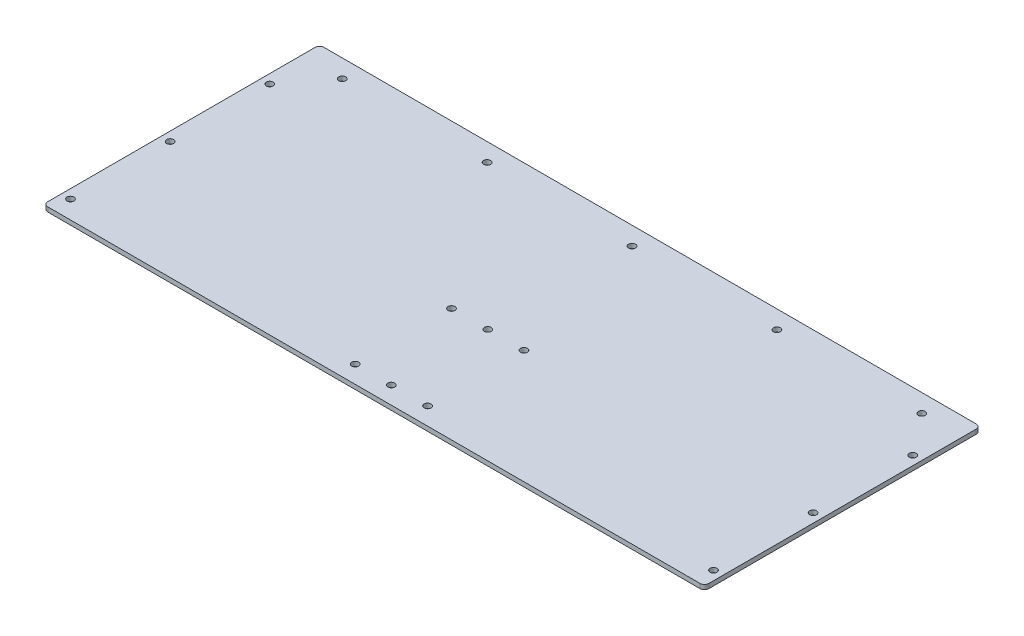
ISO-10303-21;
HEADER;
FILE_DESCRIPTION(('STEP AP214'),'2;1');
FILE_NAME('part.step','',(''),(''),'','','');
FILE_SCHEMA(('AUTOMOTIVE_DESIGN { 1 0 10303 214 1 1 1 1 }'));
ENDSEC;
DATA;
#1=APPLICATION_CONTEXT('core data for automotive mechanical design processes');
#2=APPLICATION_PROTOCOL_DEFINITION('international standard','automotive_design',2000,#1);
#3=PRODUCT_CONTEXT('',#1,'mechanical');
#4=PRODUCT('Part','Part','',(#3));
#5=PRODUCT_RELATED_PRODUCT_CATEGORY('part','',(#4));
#6=PRODUCT_DEFINITION_FORMATION('','',#4);
#7=PRODUCT_DEFINITION_CONTEXT('part definition',#1,'design');
#8=PRODUCT_DEFINITION('design','',#6,#7);
#9=PRODUCT_DEFINITION_SHAPE('','',#8);
#10=(LENGTH_UNIT() NAMED_UNIT(*) SI_UNIT(.MILLI.,.METRE.));
#11=(NAMED_UNIT(*) PLANE_ANGLE_UNIT() SI_UNIT($,.RADIAN.));
#12=(NAMED_UNIT(*) SI_UNIT($,.STERADIAN.) SOLID_ANGLE_UNIT());
#13=UNCERTAINTY_MEASURE_WITH_UNIT(LENGTH_MEASURE(1.E-05),#10,'distance_accuracy_value','');
#14=(GEOMETRIC_REPRESENTATION_CONTEXT(3) GLOBAL_UNCERTAINTY_ASSIGNED_CONTEXT((#13)) GLOBAL_UNIT_ASSIGNED_CONTEXT((#10,
#11,#12)) REPRESENTATION_CONTEXT('',''));
#15=CARTESIAN_POINT('',(0.,0.,0.));
#16=DIRECTION('',(0.,0.,1.));
#17=DIRECTION('',(1.,0.,0.));
#18=AXIS2_PLACEMENT_3D('',#15,#16,#17);
#19=CARTESIAN_POINT('',(0.,3.175,0.));
#20=DIRECTION('',(0.,-1.,0.));
#21=DIRECTION('',(0.,0.,-1.));
#22=AXIS2_PLACEMENT_3D('',#19,#20,#21);
#23=PLANE('',#22);
#24=CARTESIAN_POINT('',(6.34999999999974,3.175,-82.55));
#25=DIRECTION('',(0.,1.,0.));
#26=DIRECTION('',(0.,0.,1.));
#27=AXIS2_PLACEMENT_3D('',#24,#25,#26);
#28=CIRCLE('',#27,2.4257);
#29=CARTESIAN_POINT('',(6.34999999999974,3.175,-80.1243));
#30=VERTEX_POINT('',#29);
#31=EDGE_CURVE('E312',#30,#30,#28,.T.);
#32=ORIENTED_EDGE('',*,*,#31,.F.);
#33=EDGE_LOOP('',(#32));
#34=FACE_BOUND('',#33,.T.);
#35=CARTESIAN_POINT('',(6.34999999999952,3.175,-152.4));
#36=DIRECTION('',(0.,1.,0.));
#37=DIRECTION('',(0.,0.,1.));
#38=AXIS2_PLACEMENT_3D('',#35,#36,#37);
#39=CIRCLE('',#38,2.4257);
#40=CARTESIAN_POINT('',(6.34999999999952,3.175,-149.9743));
#41=VERTEX_POINT('',#40);
#42=EDGE_CURVE('E303',#41,#41,#39,.T.);
#43=ORIENTED_EDGE('',*,*,#42,.F.);
#44=EDGE_LOOP('',(#43));
#45=FACE_BOUND('',#44,.T.);
#46=CARTESIAN_POINT('',(457.200000000001,3.175,-152.4));
#47=DIRECTION('',(0.,1.,0.));
#48=DIRECTION('',(0.,0.,-1.));
#49=AXIS2_PLACEMENT_3D('',#46,#47,#48);
#50=CIRCLE('',#49,2.42570000000009);
#51=CARTESIAN_POINT('',(457.200000000001,3.175,-154.8257));
#52=VERTEX_POINT('',#51);
#53=EDGE_CURVE('E335',#52,#52,#50,.T.);
#54=ORIENTED_EDGE('',*,*,#53,.F.);
#55=EDGE_LOOP('',(#54));
#56=FACE_BOUND('',#55,.T.);
#57=CARTESIAN_POINT('',(457.200000000001,3.175,-82.5500000000001));
#58=DIRECTION('',(0.,1.,0.));
#59=DIRECTION('',(0.,0.,-1.));
#60=AXIS2_PLACEMENT_3D('',#57,#58,#59);
#61=CIRCLE('',#60,2.42569999999997);
#62=CARTESIAN_POINT('',(457.200000000001,3.175,-84.9757000000001));
#63=VERTEX_POINT('',#62);
#64=EDGE_CURVE('E327',#63,#63,#61,.T.);
#65=ORIENTED_EDGE('',*,*,#64,.F.);
#66=EDGE_LOOP('',(#65));
#67=FACE_BOUND('',#66,.T.);
#68=CARTESIAN_POINT('',(457.2,3.175,-12.7000000000001));
#69=DIRECTION('',(0.,1.,0.));
#70=DIRECTION('',(0.,0.,-1.));
#71=AXIS2_PLACEMENT_3D('',#68,#69,#70);
#72=CIRCLE('',#71,2.42569999999997);
#73=CARTESIAN_POINT('',(457.2,3.175,-15.1257000000001));
#74=VERTEX_POINT('',#73);
#75=EDGE_CURVE('E319',#74,#74,#72,.T.);
#76=ORIENTED_EDGE('',*,*,#75,.F.);
#77=EDGE_LOOP('',(#76));
#78=FACE_BOUND('',#77,.T.);
#79=CARTESIAN_POINT('',(6.34999999999991,3.175,-12.7));
#80=DIRECTION('',(0.,1.,0.));
#81=DIRECTION('',(0.,0.,1.));
#82=AXIS2_PLACEMENT_3D('',#79,#80,#81);
#83=CIRCLE('',#82,2.4257);
#84=CARTESIAN_POINT('',(6.34999999999991,3.175,-10.2743));
#85=VERTEX_POINT('',#84);
#86=EDGE_CURVE('E295',#85,#85,#83,.T.);
#87=ORIENTED_EDGE('',*,*,#86,.F.);
#88=EDGE_LOOP('',(#87));
#89=FACE_BOUND('',#88,.T.);
#90=DIRECTION('',(-1.,0.,0.));
#91=VECTOR('',#90,1.);
#92=CARTESIAN_POINT('',(0.,3.175,-193.675));
#93=LINE('',#92,#91);
#94=CARTESIAN_POINT('',(460.375,3.175,-193.675));
#95=VERTEX_POINT('',#94);
#96=CARTESIAN_POINT('',(3.17499999999998,3.175,-193.675));
#97=VERTEX_POINT('',#96);
#98=EDGE_CURVE('E146',#95,#97,#93,.T.);
#99=ORIENTED_EDGE('',*,*,#98,.T.);
#100=CARTESIAN_POINT('',(3.17499999999998,3.175,-190.5));
#101=DIRECTION('',(0.,-1.,0.));
#102=DIRECTION('',(0.,0.,-1.));
#103=AXIS2_PLACEMENT_3D('',#100,#101,#102);
#104=CIRCLE('',#103,3.175);
#105=CARTESIAN_POINT('',(0.,3.175,-190.5));
#106=VERTEX_POINT('',#105);
#107=EDGE_CURVE('E176',#97,#106,#104,.F.);
#108=ORIENTED_EDGE('',*,*,#107,.T.);
#109=DIRECTION('',(0.,0.,1.));
#110=VECTOR('',#109,1.);
#111=CARTESIAN_POINT('',(0.,3.175,0.));
#112=LINE('',#111,#110);
#113=CARTESIAN_POINT('',(0.,3.175,-3.17500000000001));
#114=VERTEX_POINT('',#113);
#115=EDGE_CURVE('E124',#106,#114,#112,.T.);
#116=ORIENTED_EDGE('',*,*,#115,.T.);
#117=CARTESIAN_POINT('',(3.17499999999998,3.175,-3.17500000000001));
#118=DIRECTION('',(0.,-1.,0.));
#119=DIRECTION('',(0.,0.,-1.));
#120=AXIS2_PLACEMENT_3D('',#117,#118,#119);
#121=CIRCLE('',#120,3.175);
#122=CARTESIAN_POINT('',(3.17499999999998,3.175,0.));
#123=VERTEX_POINT('',#122);
#124=EDGE_CURVE('E168',#114,#123,#121,.F.);
#125=ORIENTED_EDGE('',*,*,#124,.T.);
#126=DIRECTION('',(1.,0.,0.));
#127=VECTOR('',#126,1.);
#128=CARTESIAN_POINT('',(0.,3.175,0.));
#129=LINE('',#128,#127);
#130=CARTESIAN_POINT('',(460.375,3.175,0.));
#131=VERTEX_POINT('',#130);
#132=EDGE_CURVE('E192',#123,#131,#129,.T.);
#133=ORIENTED_EDGE('',*,*,#132,.T.);
#134=CARTESIAN_POINT('',(460.375,3.175,-3.17499999999998));
#135=DIRECTION('',(0.,-1.,0.));
#136=DIRECTION('',(0.,0.,-1.));
#137=AXIS2_PLACEMENT_3D('',#134,#135,#136);
#138=CIRCLE('',#137,3.175);
#139=CARTESIAN_POINT('',(463.55,3.175,-3.17500000000001));
#140=VERTEX_POINT('',#139);
#141=EDGE_CURVE('E59',#131,#140,#138,.F.);
#142=ORIENTED_EDGE('',*,*,#141,.T.);
#143=DIRECTION('',(0.,0.,-1.));
#144=VECTOR('',#143,1.);
#145=CARTESIAN_POINT('',(463.55,3.175,0.));
#146=LINE('',#145,#144);
#147=CARTESIAN_POINT('',(463.55,3.175,-190.5));
#148=VERTEX_POINT('',#147);
#149=EDGE_CURVE('E200',#140,#148,#146,.T.);
#150=ORIENTED_EDGE('',*,*,#149,.T.);
#151=CARTESIAN_POINT('',(460.375,3.175,-190.5));
#152=DIRECTION('',(0.,-1.,0.));
#153=DIRECTION('',(0.,0.,-1.));
#154=AXIS2_PLACEMENT_3D('',#151,#152,#153);
#155=CIRCLE('',#154,3.175);
#156=EDGE_CURVE('E173',#148,#95,#155,.F.);
#157=ORIENTED_EDGE('',*,*,#156,.T.);
#158=EDGE_LOOP('',(#99,#108,#116,#125,#133,#142,#150,#157));
#159=FACE_BOUND('',#158,.T.);
#160=CARTESIAN_POINT('',(231.775,3.175,-12.2555));
#161=DIRECTION('',(0.,1.,0.));
#162=DIRECTION('',(0.,0.,1.));
#163=AXIS2_PLACEMENT_3D('',#160,#161,#162);
#164=CIRCLE('',#163,2.4257);
#165=CARTESIAN_POINT('',(231.775,3.175,-9.8298));
#166=VERTEX_POINT('',#165);
#167=EDGE_CURVE('E134',#166,#166,#164,.T.);
#168=ORIENTED_EDGE('',*,*,#167,.F.);
#169=EDGE_LOOP('',(#168));
#170=FACE_BOUND('',#169,.T.);
#171=CARTESIAN_POINT('',(257.175,3.175,-12.2555));
#172=DIRECTION('',(0.,1.,0.));
#173=DIRECTION('',(0.,0.,1.));
#174=AXIS2_PLACEMENT_3D('',#171,#172,#173);
#175=CIRCLE('',#174,2.42569999999997);
#176=CARTESIAN_POINT('',(257.175,3.175,-9.82980000000003));
#177=VERTEX_POINT('',#176);
#178=EDGE_CURVE('E213',#177,#177,#175,.T.);
#179=ORIENTED_EDGE('',*,*,#178,.F.);
#180=EDGE_LOOP('',(#179));
#181=FACE_BOUND('',#180,.T.);
#182=CARTESIAN_POINT('',(206.375,3.175,-12.2555));
#183=DIRECTION('',(0.,1.,0.));
#184=DIRECTION('',(0.,0.,-1.));
#185=AXIS2_PLACEMENT_3D('',#182,#183,#184);
#186=CIRCLE('',#185,2.42569999999997);
#187=CARTESIAN_POINT('',(206.375,3.175,-14.6812));
#188=VERTEX_POINT('',#187);
#189=EDGE_CURVE('E219',#188,#188,#186,.T.);
#190=ORIENTED_EDGE('',*,*,#189,.F.);
#191=EDGE_LOOP('',(#190));
#192=FACE_BOUND('',#191,.T.);
#193=CARTESIAN_POINT('',(257.175,3.175,-79.8195000000001));
#194=DIRECTION('',(0.,1.,0.));
#195=DIRECTION('',(0.,0.,-1.));
#196=AXIS2_PLACEMENT_3D('',#193,#194,#195);
#197=CIRCLE('',#196,2.42569999999997);
#198=CARTESIAN_POINT('',(257.175,3.175,-82.2452));
#199=VERTEX_POINT('',#198);
#200=EDGE_CURVE('E227',#199,#199,#197,.T.);
#201=ORIENTED_EDGE('',*,*,#200,.F.);
#202=EDGE_LOOP('',(#201));
#203=FACE_BOUND('',#202,.T.);
#204=CARTESIAN_POINT('',(231.775,3.175,-79.8195000000001));
#205=DIRECTION('',(0.,1.,0.));
#206=DIRECTION('',(0.,0.,-1.));
#207=AXIS2_PLACEMENT_3D('',#204,#205,#206);
#208=CIRCLE('',#207,2.4257);
#209=CARTESIAN_POINT('',(231.775,3.175,-82.2452000000001));
#210=VERTEX_POINT('',#209);
#211=EDGE_CURVE('E235',#210,#210,#208,.T.);
#212=ORIENTED_EDGE('',*,*,#211,.F.);
#213=EDGE_LOOP('',(#212));
#214=FACE_BOUND('',#213,.T.);
#215=CARTESIAN_POINT('',(206.375,3.175,-79.8195000000001));
#216=DIRECTION('',(0.,1.,0.));
#217=DIRECTION('',(0.,0.,1.));
#218=AXIS2_PLACEMENT_3D('',#215,#216,#217);
#219=CIRCLE('',#218,2.42569999999997);
#220=CARTESIAN_POINT('',(206.375,3.175,-77.3938000000001));
#221=VERTEX_POINT('',#220);
#222=EDGE_CURVE('E243',#221,#221,#219,.T.);
#223=ORIENTED_EDGE('',*,*,#222,.F.);
#224=EDGE_LOOP('',(#223));
#225=FACE_BOUND('',#224,.T.);
#226=CARTESIAN_POINT('',(231.775,3.175,-180.975));
#227=DIRECTION('',(0.,1.,0.));
#228=DIRECTION('',(0.,0.,1.));
#229=AXIS2_PLACEMENT_3D('',#226,#227,#228);
#230=CIRCLE('',#229,2.4257);
#231=CARTESIAN_POINT('',(231.775,3.175,-178.5493));
#232=VERTEX_POINT('',#231);
#233=EDGE_CURVE('E251',#232,#232,#230,.T.);
#234=ORIENTED_EDGE('',*,*,#233,.F.);
#235=EDGE_LOOP('',(#234));
#236=FACE_BOUND('',#235,.T.);
#237=CARTESIAN_POINT('',(333.375,3.175,-180.975));
#238=DIRECTION('',(0.,1.,0.));
#239=DIRECTION('',(0.,0.,1.));
#240=AXIS2_PLACEMENT_3D('',#237,#238,#239);
#241=CIRCLE('',#240,2.42569999999997);
#242=CARTESIAN_POINT('',(333.375,3.175,-178.5493));
#243=VERTEX_POINT('',#242);
#244=EDGE_CURVE('E259',#243,#243,#241,.T.);
#245=ORIENTED_EDGE('',*,*,#244,.F.);
#246=EDGE_LOOP('',(#245));
#247=FACE_BOUND('',#246,.T.);
#248=CARTESIAN_POINT('',(434.975,3.175,-180.975));
#249=DIRECTION('',(0.,1.,0.));
#250=DIRECTION('',(0.,0.,1.));
#251=AXIS2_PLACEMENT_3D('',#248,#249,#250);
#252=CIRCLE('',#251,2.42569999999997);
#253=CARTESIAN_POINT('',(434.975,3.175,-178.5493));
#254=VERTEX_POINT('',#253);
#255=EDGE_CURVE('E267',#254,#254,#252,.T.);
#256=ORIENTED_EDGE('',*,*,#255,.F.);
#257=EDGE_LOOP('',(#256));
#258=FACE_BOUND('',#257,.T.);
#259=CARTESIAN_POINT('',(28.575,3.175,-180.975));
#260=DIRECTION('',(0.,1.,0.));
#261=DIRECTION('',(0.,0.,-1.));
#262=AXIS2_PLACEMENT_3D('',#259,#260,#261);
#263=CIRCLE('',#262,2.42569999999997);
#264=CARTESIAN_POINT('',(28.575,3.175,-183.4007));
#265=VERTEX_POINT('',#264);
#266=EDGE_CURVE('E275',#265,#265,#263,.T.);
#267=ORIENTED_EDGE('',*,*,#266,.F.);
#268=EDGE_LOOP('',(#267));
#269=FACE_BOUND('',#268,.T.);
#270=CARTESIAN_POINT('',(130.175,3.175,-180.975));
#271=DIRECTION('',(0.,1.,0.));
#272=DIRECTION('',(0.,0.,-1.));
#273=AXIS2_PLACEMENT_3D('',#270,#271,#272);
#274=CIRCLE('',#273,2.42569999999997);
#275=CARTESIAN_POINT('',(130.175,3.175,-183.4007));
#276=VERTEX_POINT('',#275);
#277=EDGE_CURVE('E283',#276,#276,#274,.T.);
#278=ORIENTED_EDGE('',*,*,#277,.F.);
#279=EDGE_LOOP('',(#278));
#280=FACE_BOUND('',#279,.T.);
#281=ADVANCED_FACE('F36',(#34,#45,#56,#67,#78,#89,#159,#170,#181,#192,#203,#214,#225,#236,#247,
#258,#269,#280),#23,.F.);
#282=CARTESIAN_POINT('',(0.,0.,0.));
#283=DIRECTION('',(0.,-1.,0.));
#284=DIRECTION('',(0.,0.,-1.));
#285=AXIS2_PLACEMENT_3D('',#282,#283,#284);
#286=PLANE('',#285);
#287=CARTESIAN_POINT('',(6.34999999999974,0.,-82.55));
#288=DIRECTION('',(0.,1.,0.));
#289=DIRECTION('',(0.,0.,1.));
#290=AXIS2_PLACEMENT_3D('',#287,#288,#289);
#291=CIRCLE('',#290,2.4257);
#292=CARTESIAN_POINT('',(6.34999999999974,0.,-80.1243));
#293=VERTEX_POINT('',#292);
#294=EDGE_CURVE('E299',#293,#293,#291,.T.);
#295=ORIENTED_EDGE('',*,*,#294,.T.);
#296=EDGE_LOOP('',(#295));
#297=FACE_BOUND('',#296,.T.);
#298=CARTESIAN_POINT('',(6.34999999999952,0.,-152.4));
#299=DIRECTION('',(0.,1.,0.));
#300=DIRECTION('',(0.,0.,1.));
#301=AXIS2_PLACEMENT_3D('',#298,#299,#300);
#302=CIRCLE('',#301,2.4257);
#303=CARTESIAN_POINT('',(6.34999999999952,0.,-149.9743));
#304=VERTEX_POINT('',#303);
#305=EDGE_CURVE('E307',#304,#304,#302,.T.);
#306=ORIENTED_EDGE('',*,*,#305,.T.);
#307=EDGE_LOOP('',(#306));
#308=FACE_BOUND('',#307,.T.);
#309=CARTESIAN_POINT('',(457.200000000001,0.,-152.4));
#310=DIRECTION('',(0.,1.,0.));
#311=DIRECTION('',(0.,0.,-1.));
#312=AXIS2_PLACEMENT_3D('',#309,#310,#311);
#313=CIRCLE('',#312,2.42570000000009);
#314=CARTESIAN_POINT('',(457.200000000001,0.,-154.8257));
#315=VERTEX_POINT('',#314);
#316=EDGE_CURVE('E308',#315,#315,#313,.T.);
#317=ORIENTED_EDGE('',*,*,#316,.T.);
#318=EDGE_LOOP('',(#317));
#319=FACE_BOUND('',#318,.T.);
#320=CARTESIAN_POINT('',(457.200000000001,0.,-82.5500000000001));
#321=DIRECTION('',(0.,1.,0.));
#322=DIRECTION('',(0.,0.,-1.));
#323=AXIS2_PLACEMENT_3D('',#320,#321,#322);
#324=CIRCLE('',#323,2.42569999999997);
#325=CARTESIAN_POINT('',(457.200000000001,0.,-84.9757000000001));
#326=VERTEX_POINT('',#325);
#327=EDGE_CURVE('E331',#326,#326,#324,.T.);
#328=ORIENTED_EDGE('',*,*,#327,.T.);
#329=EDGE_LOOP('',(#328));
#330=FACE_BOUND('',#329,.T.);
#331=CARTESIAN_POINT('',(457.2,0.,-12.7000000000001));
#332=DIRECTION('',(0.,1.,0.));
#333=DIRECTION('',(0.,0.,-1.));
#334=AXIS2_PLACEMENT_3D('',#331,#332,#333);
#335=CIRCLE('',#334,2.42569999999997);
#336=CARTESIAN_POINT('',(457.2,0.,-15.1257));
#337=VERTEX_POINT('',#336);
#338=EDGE_CURVE('E323',#337,#337,#335,.T.);
#339=ORIENTED_EDGE('',*,*,#338,.T.);
#340=EDGE_LOOP('',(#339));
#341=FACE_BOUND('',#340,.T.);
#342=CARTESIAN_POINT('',(6.34999999999991,0.,-12.7));
#343=DIRECTION('',(0.,1.,0.));
#344=DIRECTION('',(0.,0.,1.));
#345=AXIS2_PLACEMENT_3D('',#342,#343,#344);
#346=CIRCLE('',#345,2.4257);
#347=CARTESIAN_POINT('',(6.34999999999991,0.,-10.2743));
#348=VERTEX_POINT('',#347);
#349=EDGE_CURVE('E291',#348,#348,#346,.T.);
#350=ORIENTED_EDGE('',*,*,#349,.T.);
#351=EDGE_LOOP('',(#350));
#352=FACE_BOUND('',#351,.T.);
#353=CARTESIAN_POINT('',(28.575,0.,-180.975));
#354=DIRECTION('',(0.,1.,0.));
#355=DIRECTION('',(0.,0.,-1.));
#356=AXIS2_PLACEMENT_3D('',#353,#354,#355);
#357=CIRCLE('',#356,2.42569999999997);
#358=CARTESIAN_POINT('',(28.575,0.,-183.4007));
#359=VERTEX_POINT('',#358);
#360=EDGE_CURVE('E279',#359,#359,#357,.T.);
#361=ORIENTED_EDGE('',*,*,#360,.T.);
#362=EDGE_LOOP('',(#361));
#363=FACE_BOUND('',#362,.T.);
#364=CARTESIAN_POINT('',(333.375,0.,-180.975));
#365=DIRECTION('',(0.,1.,0.));
#366=DIRECTION('',(0.,0.,1.));
#367=AXIS2_PLACEMENT_3D('',#364,#365,#366);
#368=CIRCLE('',#367,2.42569999999997);
#369=CARTESIAN_POINT('',(333.375,0.,-178.5493));
#370=VERTEX_POINT('',#369);
#371=EDGE_CURVE('E263',#370,#370,#368,.T.);
#372=ORIENTED_EDGE('',*,*,#371,.T.);
#373=EDGE_LOOP('',(#372));
#374=FACE_BOUND('',#373,.T.);
#375=CARTESIAN_POINT('',(206.375,0.,-79.8195000000001));
#376=DIRECTION('',(0.,1.,0.));
#377=DIRECTION('',(0.,0.,1.));
#378=AXIS2_PLACEMENT_3D('',#375,#376,#377);
#379=CIRCLE('',#378,2.42569999999997);
#380=CARTESIAN_POINT('',(206.375,0.,-77.3938000000001));
#381=VERTEX_POINT('',#380);
#382=EDGE_CURVE('E247',#381,#381,#379,.T.);
#383=ORIENTED_EDGE('',*,*,#382,.T.);
#384=EDGE_LOOP('',(#383));
#385=FACE_BOUND('',#384,.T.);
#386=CARTESIAN_POINT('',(257.175,0.,-79.8195000000001));
#387=DIRECTION('',(0.,1.,0.));
#388=DIRECTION('',(0.,0.,-1.));
#389=AXIS2_PLACEMENT_3D('',#386,#387,#388);
#390=CIRCLE('',#389,2.42569999999997);
#391=CARTESIAN_POINT('',(257.175,0.,-82.2452));
#392=VERTEX_POINT('',#391);
#393=EDGE_CURVE('E231',#392,#392,#390,.T.);
#394=ORIENTED_EDGE('',*,*,#393,.T.);
#395=EDGE_LOOP('',(#394));
#396=FACE_BOUND('',#395,.T.);
#397=CARTESIAN_POINT('',(257.175,0.,-12.2555));
#398=DIRECTION('',(0.,1.,0.));
#399=DIRECTION('',(0.,0.,1.));
#400=AXIS2_PLACEMENT_3D('',#397,#398,#399);
#401=CIRCLE('',#400,2.42569999999997);
#402=CARTESIAN_POINT('',(257.175,0.,-9.82980000000003));
#403=VERTEX_POINT('',#402);
#404=EDGE_CURVE('E215',#403,#403,#401,.T.);
#405=ORIENTED_EDGE('',*,*,#404,.T.);
#406=EDGE_LOOP('',(#405));
#407=FACE_BOUND('',#406,.T.);
#408=DIRECTION('',(0.,0.,1.));
#409=VECTOR('',#408,1.);
#410=CARTESIAN_POINT('',(0.,0.,0.));
#411=LINE('',#410,#409);
#412=CARTESIAN_POINT('',(0.,0.,-190.5));
#413=VERTEX_POINT('',#412);
#414=CARTESIAN_POINT('',(0.,0.,-3.17500000000001));
#415=VERTEX_POINT('',#414);
#416=EDGE_CURVE('E121',#413,#415,#411,.T.);
#417=ORIENTED_EDGE('',*,*,#416,.F.);
#418=CARTESIAN_POINT('',(3.17499999999998,0.,-190.5));
#419=DIRECTION('',(0.,-1.,0.));
#420=DIRECTION('',(0.,0.,-1.));
#421=AXIS2_PLACEMENT_3D('',#418,#419,#420);
#422=CIRCLE('',#421,3.175);
#423=CARTESIAN_POINT('',(3.17499999999998,0.,-193.675));
#424=VERTEX_POINT('',#423);
#425=EDGE_CURVE('E103',#413,#424,#422,.T.);
#426=ORIENTED_EDGE('',*,*,#425,.T.);
#427=DIRECTION('',(-1.,0.,0.));
#428=VECTOR('',#427,1.);
#429=CARTESIAN_POINT('',(0.,0.,-193.675));
#430=LINE('',#429,#428);
#431=CARTESIAN_POINT('',(460.375,0.,-193.675));
#432=VERTEX_POINT('',#431);
#433=EDGE_CURVE('E151',#432,#424,#430,.T.);
#434=ORIENTED_EDGE('',*,*,#433,.F.);
#435=CARTESIAN_POINT('',(460.375,0.,-190.5));
#436=DIRECTION('',(0.,-1.,0.));
#437=DIRECTION('',(0.,0.,-1.));
#438=AXIS2_PLACEMENT_3D('',#435,#436,#437);
#439=CIRCLE('',#438,3.175);
#440=CARTESIAN_POINT('',(463.55,0.,-190.5));
#441=VERTEX_POINT('',#440);
#442=EDGE_CURVE('E115',#432,#441,#439,.T.);
#443=ORIENTED_EDGE('',*,*,#442,.T.);
#444=DIRECTION('',(0.,0.,-1.));
#445=VECTOR('',#444,1.);
#446=CARTESIAN_POINT('',(463.55,0.,0.));
#447=LINE('',#446,#445);
#448=CARTESIAN_POINT('',(463.55,0.,-3.17500000000001));
#449=VERTEX_POINT('',#448);
#450=EDGE_CURVE('E140',#449,#441,#447,.T.);
#451=ORIENTED_EDGE('',*,*,#450,.F.);
#452=CARTESIAN_POINT('',(460.375,0.,-3.17499999999998));
#453=DIRECTION('',(0.,-1.,0.));
#454=DIRECTION('',(0.,0.,-1.));
#455=AXIS2_PLACEMENT_3D('',#452,#453,#454);
#456=CIRCLE('',#455,3.175);
#457=CARTESIAN_POINT('',(460.375,0.,0.));
#458=VERTEX_POINT('',#457);
#459=EDGE_CURVE('E158',#449,#458,#456,.T.);
#460=ORIENTED_EDGE('',*,*,#459,.T.);
#461=DIRECTION('',(1.,0.,0.));
#462=VECTOR('',#461,1.);
#463=CARTESIAN_POINT('',(0.,0.,0.));
#464=LINE('',#463,#462);
#465=CARTESIAN_POINT('',(3.17499999999998,0.,0.));
#466=VERTEX_POINT('',#465);
#467=EDGE_CURVE('E133',#466,#458,#464,.T.);
#468=ORIENTED_EDGE('',*,*,#467,.F.);
#469=CARTESIAN_POINT('',(3.17499999999998,0.,-3.17500000000001));
#470=DIRECTION('',(0.,-1.,0.));
#471=DIRECTION('',(0.,0.,-1.));
#472=AXIS2_PLACEMENT_3D('',#469,#470,#471);
#473=CIRCLE('',#472,3.175);
#474=EDGE_CURVE('E126',#466,#415,#473,.T.);
#475=ORIENTED_EDGE('',*,*,#474,.T.);
#476=EDGE_LOOP('',(#417,#426,#434,#443,#451,#460,#468,#475));
#477=FACE_BOUND('',#476,.T.);
#478=CARTESIAN_POINT('',(231.775,0.,-12.2555));
#479=DIRECTION('',(0.,1.,0.));
#480=DIRECTION('',(0.,0.,1.));
#481=AXIS2_PLACEMENT_3D('',#478,#479,#480);
#482=CIRCLE('',#481,2.4257);
#483=CARTESIAN_POINT('',(231.775,0.,-9.8298));
#484=VERTEX_POINT('',#483);
#485=EDGE_CURVE('E143',#484,#484,#482,.T.);
#486=ORIENTED_EDGE('',*,*,#485,.T.);
#487=EDGE_LOOP('',(#486));
#488=FACE_BOUND('',#487,.T.);
#489=CARTESIAN_POINT('',(206.375,0.,-12.2555));
#490=DIRECTION('',(0.,1.,0.));
#491=DIRECTION('',(0.,0.,-1.));
#492=AXIS2_PLACEMENT_3D('',#489,#490,#491);
#493=CIRCLE('',#492,2.42569999999997);
#494=CARTESIAN_POINT('',(206.375,0.,-14.6812));
#495=VERTEX_POINT('',#494);
#496=EDGE_CURVE('E223',#495,#495,#493,.T.);
#497=ORIENTED_EDGE('',*,*,#496,.T.);
#498=EDGE_LOOP('',(#497));
#499=FACE_BOUND('',#498,.T.);
#500=CARTESIAN_POINT('',(231.775,0.,-79.8195000000001));
#501=DIRECTION('',(0.,1.,0.));
#502=DIRECTION('',(0.,0.,-1.));
#503=AXIS2_PLACEMENT_3D('',#500,#501,#502);
#504=CIRCLE('',#503,2.4257);
#505=CARTESIAN_POINT('',(231.775,0.,-82.2452000000001));
#506=VERTEX_POINT('',#505);
#507=EDGE_CURVE('E239',#506,#506,#504,.T.);
#508=ORIENTED_EDGE('',*,*,#507,.T.);
#509=EDGE_LOOP('',(#508));
#510=FACE_BOUND('',#509,.T.);
#511=CARTESIAN_POINT('',(231.775,0.,-180.975));
#512=DIRECTION('',(0.,1.,0.));
#513=DIRECTION('',(0.,0.,1.));
#514=AXIS2_PLACEMENT_3D('',#511,#512,#513);
#515=CIRCLE('',#514,2.4257);
#516=CARTESIAN_POINT('',(231.775,0.,-178.5493));
#517=VERTEX_POINT('',#516);
#518=EDGE_CURVE('E255',#517,#517,#515,.T.);
#519=ORIENTED_EDGE('',*,*,#518,.T.);
#520=EDGE_LOOP('',(#519));
#521=FACE_BOUND('',#520,.T.);
#522=CARTESIAN_POINT('',(434.975,0.,-180.975));
#523=DIRECTION('',(0.,1.,0.));
#524=DIRECTION('',(0.,0.,1.));
#525=AXIS2_PLACEMENT_3D('',#522,#523,#524);
#526=CIRCLE('',#525,2.42569999999997);
#527=CARTESIAN_POINT('',(434.975,0.,-178.5493));
#528=VERTEX_POINT('',#527);
#529=EDGE_CURVE('E271',#528,#528,#526,.T.);
#530=ORIENTED_EDGE('',*,*,#529,.T.);
#531=EDGE_LOOP('',(#530));
#532=FACE_BOUND('',#531,.T.);
#533=CARTESIAN_POINT('',(130.175,0.,-180.975));
#534=DIRECTION('',(0.,1.,0.));
#535=DIRECTION('',(0.,0.,-1.));
#536=AXIS2_PLACEMENT_3D('',#533,#534,#535);
#537=CIRCLE('',#536,2.42569999999997);
#538=CARTESIAN_POINT('',(130.175,0.,-183.4007));
#539=VERTEX_POINT('',#538);
#540=EDGE_CURVE('E287',#539,#539,#537,.T.);
#541=ORIENTED_EDGE('',*,*,#540,.T.);
#542=EDGE_LOOP('',(#541));
#543=FACE_BOUND('',#542,.T.);
#544=ADVANCED_FACE('F129',(#297,#308,#319,#330,#341,#352,#363,#374,#385,#396,#407,#477,#488,
#499,#510,#521,#532,#543),#286,.T.);
#545=CARTESIAN_POINT('',(0.,3.175,0.));
#546=DIRECTION('',(1.,0.,0.));
#547=DIRECTION('',(0.,0.,-1.));
#548=AXIS2_PLACEMENT_3D('',#545,#546,#547);
#549=PLANE('',#548);
#550=ORIENTED_EDGE('',*,*,#115,.F.);
#551=DIRECTION('',(0.,-1.,0.));
#552=VECTOR('',#551,1.);
#553=CARTESIAN_POINT('',(0.,3.175,-190.5));
#554=LINE('',#553,#552);
#555=EDGE_CURVE('E107',#106,#413,#554,.T.);
#556=ORIENTED_EDGE('',*,*,#555,.T.);
#557=ORIENTED_EDGE('',*,*,#416,.T.);
#558=DIRECTION('',(0.,-1.,0.));
#559=VECTOR('',#558,1.);
#560=CARTESIAN_POINT('',(0.,3.175,-3.17500000000001));
#561=LINE('',#560,#559);
#562=EDGE_CURVE('E127',#415,#114,#561,.F.);
#563=ORIENTED_EDGE('',*,*,#562,.T.);
#564=EDGE_LOOP('',(#550,#556,#557,#563));
#565=FACE_BOUND('',#564,.T.);
#566=ADVANCED_FACE('F120',(#565),#549,.F.);
#567=CARTESIAN_POINT('',(0.,3.175,0.));
#568=DIRECTION('',(0.,0.,-1.));
#569=DIRECTION('',(-1.,0.,0.));
#570=AXIS2_PLACEMENT_3D('',#567,#568,#569);
#571=PLANE('',#570);
#572=ORIENTED_EDGE('',*,*,#467,.T.);
#573=DIRECTION('',(0.,-1.,0.));
#574=VECTOR('',#573,1.);
#575=CARTESIAN_POINT('',(460.375,3.175,0.));
#576=LINE('',#575,#574);
#577=EDGE_CURVE('E11',#458,#131,#576,.F.);
#578=ORIENTED_EDGE('',*,*,#577,.T.);
#579=ORIENTED_EDGE('',*,*,#132,.F.);
#580=DIRECTION('',(0.,-1.,0.));
#581=VECTOR('',#580,1.);
#582=CARTESIAN_POINT('',(3.17499999999998,3.175,0.));
#583=LINE('',#582,#581);
#584=EDGE_CURVE('E45',#123,#466,#583,.T.);
#585=ORIENTED_EDGE('',*,*,#584,.T.);
#586=EDGE_LOOP('',(#572,#578,#579,#585));
#587=FACE_BOUND('',#586,.T.);
#588=ADVANCED_FACE('F190',(#587),#571,.F.);
#589=CARTESIAN_POINT('',(463.55,3.175,0.));
#590=DIRECTION('',(-1.,0.,0.));
#591=DIRECTION('',(0.,0.,1.));
#592=AXIS2_PLACEMENT_3D('',#589,#590,#591);
#593=PLANE('',#592);
#594=ORIENTED_EDGE('',*,*,#450,.T.);
#595=DIRECTION('',(0.,-1.,0.));
#596=VECTOR('',#595,1.);
#597=CARTESIAN_POINT('',(463.55,3.175,-190.5));
#598=LINE('',#597,#596);
#599=EDGE_CURVE('E52',#441,#148,#598,.F.);
#600=ORIENTED_EDGE('',*,*,#599,.T.);
#601=ORIENTED_EDGE('',*,*,#149,.F.);
#602=DIRECTION('',(0.,-1.,0.));
#603=VECTOR('',#602,1.);
#604=CARTESIAN_POINT('',(463.55,3.175,-3.17500000000001));
#605=LINE('',#604,#603);
#606=EDGE_CURVE('E179',#140,#449,#605,.T.);
#607=ORIENTED_EDGE('',*,*,#606,.T.);
#608=EDGE_LOOP('',(#594,#600,#601,#607));
#609=FACE_BOUND('',#608,.T.);
#610=ADVANCED_FACE('F199',(#609),#593,.F.);
#611=CARTESIAN_POINT('',(0.,3.175,-193.675));
#612=DIRECTION('',(0.,0.,1.));
#613=DIRECTION('',(1.,0.,0.));
#614=AXIS2_PLACEMENT_3D('',#611,#612,#613);
#615=PLANE('',#614);
#616=ORIENTED_EDGE('',*,*,#433,.T.);
#617=DIRECTION('',(0.,-1.,0.));
#618=VECTOR('',#617,1.);
#619=CARTESIAN_POINT('',(3.17499999999998,3.175,-193.675));
#620=LINE('',#619,#618);
#621=EDGE_CURVE('E108',#424,#97,#620,.F.);
#622=ORIENTED_EDGE('',*,*,#621,.T.);
#623=ORIENTED_EDGE('',*,*,#98,.F.);
#624=DIRECTION('',(0.,-1.,0.));
#625=VECTOR('',#624,1.);
#626=CARTESIAN_POINT('',(460.375,3.175,-193.675));
#627=LINE('',#626,#625);
#628=EDGE_CURVE('E114',#95,#432,#627,.T.);
#629=ORIENTED_EDGE('',*,*,#628,.T.);
#630=EDGE_LOOP('',(#616,#622,#623,#629));
#631=FACE_BOUND('',#630,.T.);
#632=ADVANCED_FACE('F405',(#631),#615,.F.);
#633=CARTESIAN_POINT('',(231.775,3.175,-12.2555));
#634=DIRECTION('',(0.,-1.,0.));
#635=DIRECTION('',(0.,0.,-1.));
#636=AXIS2_PLACEMENT_3D('',#633,#634,#635);
#637=CYLINDRICAL_SURFACE('',#636,2.4257);
#638=ORIENTED_EDGE('',*,*,#167,.T.);
#639=EDGE_LOOP('',(#638));
#640=FACE_BOUND('',#639,.T.);
#641=ORIENTED_EDGE('',*,*,#485,.F.);
#642=EDGE_LOOP('',(#641));
#643=FACE_BOUND('',#642,.T.);
#644=ADVANCED_FACE('F408',(#640,#643),#637,.F.);
#645=CARTESIAN_POINT('',(257.175,3.175,-12.2555));
#646=DIRECTION('',(0.,-1.,0.));
#647=DIRECTION('',(0.,0.,-1.));
#648=AXIS2_PLACEMENT_3D('',#645,#646,#647);
#649=CYLINDRICAL_SURFACE('',#648,2.42569999999997);
#650=ORIENTED_EDGE('',*,*,#178,.T.);
#651=EDGE_LOOP('',(#650));
#652=FACE_BOUND('',#651,.T.);
#653=ORIENTED_EDGE('',*,*,#404,.F.);
#654=EDGE_LOOP('',(#653));
#655=FACE_BOUND('',#654,.T.);
#656=ADVANCED_FACE('F579',(#652,#655),#649,.F.);
#657=CARTESIAN_POINT('',(206.375,3.175,-12.2555));
#658=DIRECTION('',(0.,-1.,0.));
#659=DIRECTION('',(0.,0.,-1.));
#660=AXIS2_PLACEMENT_3D('',#657,#658,#659);
#661=CYLINDRICAL_SURFACE('',#660,2.42569999999997);
#662=ORIENTED_EDGE('',*,*,#189,.T.);
#663=EDGE_LOOP('',(#662));
#664=FACE_BOUND('',#663,.T.);
#665=ORIENTED_EDGE('',*,*,#496,.F.);
#666=EDGE_LOOP('',(#665));
#667=FACE_BOUND('',#666,.T.);
#668=ADVANCED_FACE('F569',(#664,#667),#661,.F.);
#669=CARTESIAN_POINT('',(257.175,3.175,-79.8195000000001));
#670=DIRECTION('',(0.,-1.,0.));
#671=DIRECTION('',(0.,0.,-1.));
#672=AXIS2_PLACEMENT_3D('',#669,#670,#671);
#673=CYLINDRICAL_SURFACE('',#672,2.42569999999997);
#674=ORIENTED_EDGE('',*,*,#200,.T.);
#675=EDGE_LOOP('',(#674));
#676=FACE_BOUND('',#675,.T.);
#677=ORIENTED_EDGE('',*,*,#393,.F.);
#678=EDGE_LOOP('',(#677));
#679=FACE_BOUND('',#678,.T.);
#680=ADVANCED_FACE('F559',(#676,#679),#673,.F.);
#681=CARTESIAN_POINT('',(231.775,3.175,-79.8195000000001));
#682=DIRECTION('',(0.,-1.,0.));
#683=DIRECTION('',(0.,0.,-1.));
#684=AXIS2_PLACEMENT_3D('',#681,#682,#683);
#685=CYLINDRICAL_SURFACE('',#684,2.4257);
#686=ORIENTED_EDGE('',*,*,#211,.T.);
#687=EDGE_LOOP('',(#686));
#688=FACE_BOUND('',#687,.T.);
#689=ORIENTED_EDGE('',*,*,#507,.F.);
#690=EDGE_LOOP('',(#689));
#691=FACE_BOUND('',#690,.T.);
#692=ADVANCED_FACE('F549',(#688,#691),#685,.F.);
#693=CARTESIAN_POINT('',(206.375,3.175,-79.8195000000001));
#694=DIRECTION('',(0.,-1.,0.));
#695=DIRECTION('',(0.,0.,-1.));
#696=AXIS2_PLACEMENT_3D('',#693,#694,#695);
#697=CYLINDRICAL_SURFACE('',#696,2.42569999999997);
#698=ORIENTED_EDGE('',*,*,#222,.T.);
#699=EDGE_LOOP('',(#698));
#700=FACE_BOUND('',#699,.T.);
#701=ORIENTED_EDGE('',*,*,#382,.F.);
#702=EDGE_LOOP('',(#701));
#703=FACE_BOUND('',#702,.T.);
#704=ADVANCED_FACE('F539',(#700,#703),#697,.F.);
#705=CARTESIAN_POINT('',(231.775,3.175,-180.975));
#706=DIRECTION('',(0.,-1.,0.));
#707=DIRECTION('',(0.,0.,-1.));
#708=AXIS2_PLACEMENT_3D('',#705,#706,#707);
#709=CYLINDRICAL_SURFACE('',#708,2.4257);
#710=ORIENTED_EDGE('',*,*,#233,.T.);
#711=EDGE_LOOP('',(#710));
#712=FACE_BOUND('',#711,.T.);
#713=ORIENTED_EDGE('',*,*,#518,.F.);
#714=EDGE_LOOP('',(#713));
#715=FACE_BOUND('',#714,.T.);
#716=ADVANCED_FACE('F529',(#712,#715),#709,.F.);
#717=CARTESIAN_POINT('',(333.375,3.175,-180.975));
#718=DIRECTION('',(0.,-1.,0.));
#719=DIRECTION('',(0.,0.,-1.));
#720=AXIS2_PLACEMENT_3D('',#717,#718,#719);
#721=CYLINDRICAL_SURFACE('',#720,2.42569999999997);
#722=ORIENTED_EDGE('',*,*,#244,.T.);
#723=EDGE_LOOP('',(#722));
#724=FACE_BOUND('',#723,.T.);
#725=ORIENTED_EDGE('',*,*,#371,.F.);
#726=EDGE_LOOP('',(#725));
#727=FACE_BOUND('',#726,.T.);
#728=ADVANCED_FACE('F519',(#724,#727),#721,.F.);
#729=CARTESIAN_POINT('',(434.975,3.175,-180.975));
#730=DIRECTION('',(0.,-1.,0.));
#731=DIRECTION('',(0.,0.,-1.));
#732=AXIS2_PLACEMENT_3D('',#729,#730,#731);
#733=CYLINDRICAL_SURFACE('',#732,2.42569999999997);
#734=ORIENTED_EDGE('',*,*,#255,.T.);
#735=EDGE_LOOP('',(#734));
#736=FACE_BOUND('',#735,.T.);
#737=ORIENTED_EDGE('',*,*,#529,.F.);
#738=EDGE_LOOP('',(#737));
#739=FACE_BOUND('',#738,.T.);
#740=ADVANCED_FACE('F509',(#736,#739),#733,.F.);
#741=CARTESIAN_POINT('',(28.575,3.175,-180.975));
#742=DIRECTION('',(0.,-1.,0.));
#743=DIRECTION('',(0.,0.,-1.));
#744=AXIS2_PLACEMENT_3D('',#741,#742,#743);
#745=CYLINDRICAL_SURFACE('',#744,2.42569999999997);
#746=ORIENTED_EDGE('',*,*,#266,.T.);
#747=EDGE_LOOP('',(#746));
#748=FACE_BOUND('',#747,.T.);
#749=ORIENTED_EDGE('',*,*,#360,.F.);
#750=EDGE_LOOP('',(#749));
#751=FACE_BOUND('',#750,.T.);
#752=ADVANCED_FACE('F391',(#748,#751),#745,.F.);
#753=CARTESIAN_POINT('',(130.175,3.175,-180.975));
#754=DIRECTION('',(0.,-1.,0.));
#755=DIRECTION('',(0.,0.,-1.));
#756=AXIS2_PLACEMENT_3D('',#753,#754,#755);
#757=CYLINDRICAL_SURFACE('',#756,2.42569999999997);
#758=ORIENTED_EDGE('',*,*,#277,.T.);
#759=EDGE_LOOP('',(#758));
#760=FACE_BOUND('',#759,.T.);
#761=ORIENTED_EDGE('',*,*,#540,.F.);
#762=EDGE_LOOP('',(#761));
#763=FACE_BOUND('',#762,.T.);
#764=ADVANCED_FACE('F387',(#760,#763),#757,.F.);
#765=CARTESIAN_POINT('',(6.34999999999991,0.,-12.7));
#766=DIRECTION('',(0.,1.,0.));
#767=DIRECTION('',(0.,0.,1.));
#768=AXIS2_PLACEMENT_3D('',#765,#766,#767);
#769=CYLINDRICAL_SURFACE('',#768,2.4257);
#770=ORIENTED_EDGE('',*,*,#349,.F.);
#771=EDGE_LOOP('',(#770));
#772=FACE_BOUND('',#771,.T.);
#773=ORIENTED_EDGE('',*,*,#86,.T.);
#774=EDGE_LOOP('',(#773));
#775=FACE_BOUND('',#774,.T.);
#776=ADVANCED_FACE('F390',(#772,#775),#769,.F.);
#777=CARTESIAN_POINT('',(457.2,0.,-12.7000000000001));
#778=DIRECTION('',(0.,1.,0.));
#779=DIRECTION('',(0.,0.,1.));
#780=AXIS2_PLACEMENT_3D('',#777,#778,#779);
#781=CYLINDRICAL_SURFACE('',#780,2.42569999999997);
#782=ORIENTED_EDGE('',*,*,#338,.F.);
#783=EDGE_LOOP('',(#782));
#784=FACE_BOUND('',#783,.T.);
#785=ORIENTED_EDGE('',*,*,#75,.T.);
#786=EDGE_LOOP('',(#785));
#787=FACE_BOUND('',#786,.T.);
#788=ADVANCED_FACE('F475',(#784,#787),#781,.F.);
#789=CARTESIAN_POINT('',(457.200000000001,0.,-82.5500000000001));
#790=DIRECTION('',(0.,1.,0.));
#791=DIRECTION('',(0.,0.,1.));
#792=AXIS2_PLACEMENT_3D('',#789,#790,#791);
#793=CYLINDRICAL_SURFACE('',#792,2.42569999999997);
#794=ORIENTED_EDGE('',*,*,#327,.F.);
#795=EDGE_LOOP('',(#794));
#796=FACE_BOUND('',#795,.T.);
#797=ORIENTED_EDGE('',*,*,#64,.T.);
#798=EDGE_LOOP('',(#797));
#799=FACE_BOUND('',#798,.T.);
#800=ADVANCED_FACE('F350',(#796,#799),#793,.F.);
#801=CARTESIAN_POINT('',(457.200000000001,0.,-152.4));
#802=DIRECTION('',(0.,1.,0.));
#803=DIRECTION('',(0.,0.,1.));
#804=AXIS2_PLACEMENT_3D('',#801,#802,#803);
#805=CYLINDRICAL_SURFACE('',#804,2.42570000000009);
#806=ORIENTED_EDGE('',*,*,#316,.F.);
#807=EDGE_LOOP('',(#806));
#808=FACE_BOUND('',#807,.T.);
#809=ORIENTED_EDGE('',*,*,#53,.T.);
#810=EDGE_LOOP('',(#809));
#811=FACE_BOUND('',#810,.T.);
#812=ADVANCED_FACE('F346',(#808,#811),#805,.F.);
#813=CARTESIAN_POINT('',(6.34999999999952,0.,-152.4));
#814=DIRECTION('',(0.,1.,0.));
#815=DIRECTION('',(0.,0.,1.));
#816=AXIS2_PLACEMENT_3D('',#813,#814,#815);
#817=CYLINDRICAL_SURFACE('',#816,2.4257);
#818=ORIENTED_EDGE('',*,*,#305,.F.);
#819=EDGE_LOOP('',(#818));
#820=FACE_BOUND('',#819,.T.);
#821=ORIENTED_EDGE('',*,*,#42,.T.);
#822=EDGE_LOOP('',(#821));
#823=FACE_BOUND('',#822,.T.);
#824=ADVANCED_FACE('F349',(#820,#823),#817,.F.);
#825=CARTESIAN_POINT('',(6.34999999999974,0.,-82.55));
#826=DIRECTION('',(0.,1.,0.));
#827=DIRECTION('',(0.,0.,1.));
#828=AXIS2_PLACEMENT_3D('',#825,#826,#827);
#829=CYLINDRICAL_SURFACE('',#828,2.4257);
#830=ORIENTED_EDGE('',*,*,#294,.F.);
#831=EDGE_LOOP('',(#830));
#832=FACE_BOUND('',#831,.T.);
#833=ORIENTED_EDGE('',*,*,#31,.T.);
#834=EDGE_LOOP('',(#833));
#835=FACE_BOUND('',#834,.T.);
#836=ADVANCED_FACE('F417',(#832,#835),#829,.F.);
#837=CARTESIAN_POINT('',(3.17499999999998,3.175,-190.5));
#838=DIRECTION('',(0.,-1.,0.));
#839=DIRECTION('',(0.,0.,-1.));
#840=AXIS2_PLACEMENT_3D('',#837,#838,#839);
#841=CYLINDRICAL_SURFACE('',#840,3.175);
#842=ORIENTED_EDGE('',*,*,#107,.F.);
#843=ORIENTED_EDGE('',*,*,#621,.F.);
#844=ORIENTED_EDGE('',*,*,#425,.F.);
#845=ORIENTED_EDGE('',*,*,#555,.F.);
#846=EDGE_LOOP('',(#842,#843,#844,#845));
#847=FACE_BOUND('',#846,.T.);
#848=ADVANCED_FACE('F106',(#847),#841,.T.);
#849=CARTESIAN_POINT('',(460.375,3.175,-190.5));
#850=DIRECTION('',(0.,-1.,0.));
#851=DIRECTION('',(0.,0.,-1.));
#852=AXIS2_PLACEMENT_3D('',#849,#850,#851);
#853=CYLINDRICAL_SURFACE('',#852,3.175);
#854=ORIENTED_EDGE('',*,*,#156,.F.);
#855=ORIENTED_EDGE('',*,*,#599,.F.);
#856=ORIENTED_EDGE('',*,*,#442,.F.);
#857=ORIENTED_EDGE('',*,*,#628,.F.);
#858=EDGE_LOOP('',(#854,#855,#856,#857));
#859=FACE_BOUND('',#858,.T.);
#860=ADVANCED_FACE('F416',(#859),#853,.T.);
#861=CARTESIAN_POINT('',(460.375,3.175,-3.17499999999998));
#862=DIRECTION('',(0.,-1.,0.));
#863=DIRECTION('',(0.,0.,-1.));
#864=AXIS2_PLACEMENT_3D('',#861,#862,#863);
#865=CYLINDRICAL_SURFACE('',#864,3.175);
#866=ORIENTED_EDGE('',*,*,#141,.F.);
#867=ORIENTED_EDGE('',*,*,#577,.F.);
#868=ORIENTED_EDGE('',*,*,#459,.F.);
#869=ORIENTED_EDGE('',*,*,#606,.F.);
#870=EDGE_LOOP('',(#866,#867,#868,#869));
#871=FACE_BOUND('',#870,.T.);
#872=ADVANCED_FACE('F198',(#871),#865,.T.);
#873=CARTESIAN_POINT('',(3.17499999999998,3.175,-3.17500000000001));
#874=DIRECTION('',(0.,-1.,0.));
#875=DIRECTION('',(0.,0.,-1.));
#876=AXIS2_PLACEMENT_3D('',#873,#874,#875);
#877=CYLINDRICAL_SURFACE('',#876,3.175);
#878=ORIENTED_EDGE('',*,*,#124,.F.);
#879=ORIENTED_EDGE('',*,*,#562,.F.);
#880=ORIENTED_EDGE('',*,*,#474,.F.);
#881=ORIENTED_EDGE('',*,*,#584,.F.);
#882=EDGE_LOOP('',(#878,#879,#880,#881));
#883=FACE_BOUND('',#882,.T.);
#884=ADVANCED_FACE('F38',(#883),#877,.T.);
#885=CLOSED_SHELL('',(#281,#544,#566,#588,#610,#632,#644,#656,#668,#680,#692,#704,#716,#728,
#740,#752,#764,#776,#788,#800,#812,#824,#836,#848,#860,#872,#884));
#886=MANIFOLD_SOLID_BREP('B2',#885);
#887=ADVANCED_BREP_SHAPE_REPRESENTATION('',(#18,#886),#14);
#888=SHAPE_DEFINITION_REPRESENTATION(#9,#887);
ENDSEC;
END-ISO-10303-21;
